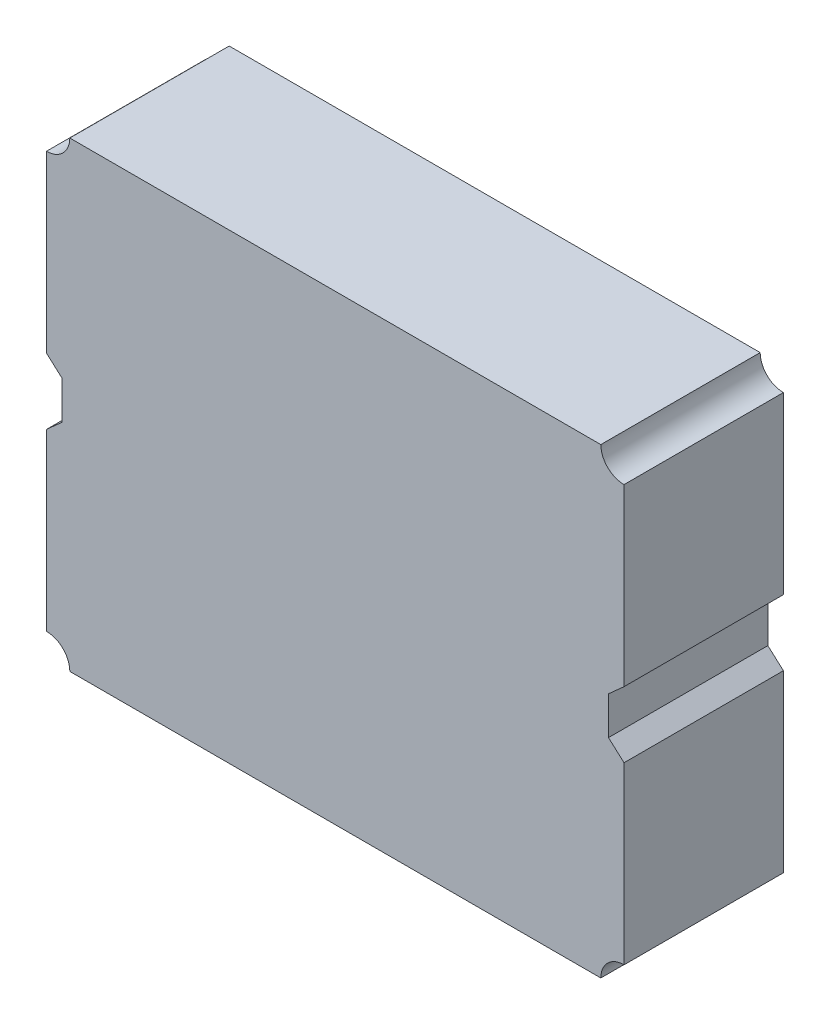
ISO-10303-21;
HEADER;
FILE_DESCRIPTION(('STEP AP214'),'2;1');
FILE_NAME('part.step','',(''),(''),'','','');
FILE_SCHEMA(('AUTOMOTIVE_DESIGN { 1 0 10303 214 1 1 1 1 }'));
ENDSEC;
DATA;
#1=APPLICATION_CONTEXT('core data for automotive mechanical design processes');
#2=APPLICATION_PROTOCOL_DEFINITION('international standard','automotive_design',2000,#1);
#3=PRODUCT_CONTEXT('',#1,'mechanical');
#4=PRODUCT('Part','Part','',(#3));
#5=PRODUCT_RELATED_PRODUCT_CATEGORY('part','',(#4));
#6=PRODUCT_DEFINITION_FORMATION('','',#4);
#7=PRODUCT_DEFINITION_CONTEXT('part definition',#1,'design');
#8=PRODUCT_DEFINITION('design','',#6,#7);
#9=PRODUCT_DEFINITION_SHAPE('','',#8);
#10=(LENGTH_UNIT() NAMED_UNIT(*) SI_UNIT(.MILLI.,.METRE.));
#11=(NAMED_UNIT(*) PLANE_ANGLE_UNIT() SI_UNIT($,.RADIAN.));
#12=(NAMED_UNIT(*) SI_UNIT($,.STERADIAN.) SOLID_ANGLE_UNIT());
#13=UNCERTAINTY_MEASURE_WITH_UNIT(LENGTH_MEASURE(1.E-05),#10,'distance_accuracy_value','');
#14=(GEOMETRIC_REPRESENTATION_CONTEXT(3) GLOBAL_UNCERTAINTY_ASSIGNED_CONTEXT((#13)) GLOBAL_UNIT_ASSIGNED_CONTEXT((#10,
#11,#12)) REPRESENTATION_CONTEXT('',''));
#15=CARTESIAN_POINT('',(0.,0.,0.));
#16=DIRECTION('',(0.,0.,1.));
#17=DIRECTION('',(1.,0.,0.));
#18=AXIS2_PLACEMENT_3D('',#15,#16,#17);
#19=CARTESIAN_POINT('',(0.,0.,0.));
#20=DIRECTION('',(0.,0.,1.));
#21=DIRECTION('',(1.,0.,0.));
#22=AXIS2_PLACEMENT_3D('',#19,#20,#21);
#23=PLANE('',#22);
#24=DIRECTION('',(0.744134494336564,0.668029830425608,0.));
#25=VECTOR('',#24,1.);
#26=CARTESIAN_POINT('',(1.216341717238,0.112366401347,0.));
#27=LINE('',#26,#25);
#28=CARTESIAN_POINT('',(1.18268343447503,0.0821504429447447,0.));
#29=VERTEX_POINT('',#28);
#30=CARTESIAN_POINT('',(1.2500000000001,0.142582359748888,0.));
#31=VERTEX_POINT('',#30);
#32=EDGE_CURVE('E191',#29,#31,#27,.T.);
#33=ORIENTED_EDGE('',*,*,#32,.F.);
#34=DIRECTION('',(0.,1.,0.));
#35=VECTOR('',#34,1.);
#36=CARTESIAN_POINT('',(1.182683434475,0.,0.));
#37=LINE('',#36,#35);
#38=CARTESIAN_POINT('',(1.18268343447503,-0.0821504429448401,0.));
#39=VERTEX_POINT('',#38);
#40=EDGE_CURVE('E202',#39,#29,#37,.T.);
#41=ORIENTED_EDGE('',*,*,#40,.F.);
#42=DIRECTION('',(-0.744134494336564,0.668029830425608,0.));
#43=VECTOR('',#42,1.);
#44=CARTESIAN_POINT('',(1.216341717238,-0.112366401347,0.));
#45=LINE('',#44,#43);
#46=CARTESIAN_POINT('',(1.2500000000002,-0.142582359748776,0.));
#47=VERTEX_POINT('',#46);
#48=EDGE_CURVE('E101',#47,#39,#45,.T.);
#49=ORIENTED_EDGE('',*,*,#48,.F.);
#50=DIRECTION('',(0.,1.,0.));
#51=VECTOR('',#50,1.);
#52=CARTESIAN_POINT('',(1.25,-0.521456601351,0.));
#53=LINE('',#52,#51);
#54=CARTESIAN_POINT('',(1.25,-0.900330842954046,0.));
#55=VERTEX_POINT('',#54);
#56=EDGE_CURVE('E95',#55,#47,#53,.T.);
#57=ORIENTED_EDGE('',*,*,#56,.F.);
#58=CARTESIAN_POINT('',(1.249135181183,-1.,0.));
#59=DIRECTION('',(0.,0.,-1.));
#60=DIRECTION('',(-1.,0.,0.));
#61=AXIS2_PLACEMENT_3D('',#58,#59,#60);
#62=CIRCLE('',#61,0.0996729089464);
#63=CARTESIAN_POINT('',(1.1494622722366,-1.,0.));
#64=VERTEX_POINT('',#63);
#65=EDGE_CURVE('E20',#64,#55,#62,.T.);
#66=ORIENTED_EDGE('',*,*,#65,.F.);
#67=DIRECTION('',(1.,0.,0.));
#68=VECTOR('',#67,1.);
#69=CARTESIAN_POINT('',(0.,-1.,0.));
#70=LINE('',#69,#68);
#71=CARTESIAN_POINT('',(-1.1494622722368,-1.,0.));
#72=VERTEX_POINT('',#71);
#73=EDGE_CURVE('E113',#72,#64,#70,.T.);
#74=ORIENTED_EDGE('',*,*,#73,.F.);
#75=CARTESIAN_POINT('',(-1.249135181183,-1.,0.));
#76=DIRECTION('',(0.,0.,-1.));
#77=DIRECTION('',(-1.,0.,0.));
#78=AXIS2_PLACEMENT_3D('',#75,#76,#77);
#79=CIRCLE('',#78,0.0996729089464);
#80=CARTESIAN_POINT('',(-1.25,-0.900330842954046,0.));
#81=VERTEX_POINT('',#80);
#82=EDGE_CURVE('E119',#72,#81,#79,.F.);
#83=ORIENTED_EDGE('',*,*,#82,.T.);
#84=DIRECTION('',(0.,1.,0.));
#85=VECTOR('',#84,1.);
#86=CARTESIAN_POINT('',(-1.25,-0.521456601351,0.));
#87=LINE('',#86,#85);
#88=CARTESIAN_POINT('',(-1.2500000000001,-0.142582359748888,0.));
#89=VERTEX_POINT('',#88);
#90=EDGE_CURVE('E123',#89,#81,#87,.F.);
#91=ORIENTED_EDGE('',*,*,#90,.F.);
#92=DIRECTION('',(-0.744134494336564,-0.668029830425608,0.));
#93=VECTOR('',#92,1.);
#94=CARTESIAN_POINT('',(-1.216341717238,-0.112366401347,0.));
#95=LINE('',#94,#93);
#96=CARTESIAN_POINT('',(-1.18268343447503,-0.0821504429447447,0.));
#97=VERTEX_POINT('',#96);
#98=EDGE_CURVE('E136',#97,#89,#95,.T.);
#99=ORIENTED_EDGE('',*,*,#98,.F.);
#100=DIRECTION('',(0.,1.,0.));
#101=VECTOR('',#100,1.);
#102=CARTESIAN_POINT('',(-1.182683434475,0.,0.));
#103=LINE('',#102,#101);
#104=CARTESIAN_POINT('',(-1.18268343447503,0.0821504429448809,0.));
#105=VERTEX_POINT('',#104);
#106=EDGE_CURVE('E147',#105,#97,#103,.F.);
#107=ORIENTED_EDGE('',*,*,#106,.F.);
#108=DIRECTION('',(0.744134494336564,-0.668029830425608,0.));
#109=VECTOR('',#108,1.);
#110=CARTESIAN_POINT('',(-1.216341717238,0.112366401347,0.));
#111=LINE('',#110,#109);
#112=CARTESIAN_POINT('',(-1.2500000000002,0.142582359748664,0.));
#113=VERTEX_POINT('',#112);
#114=EDGE_CURVE('E158',#113,#105,#111,.T.);
#115=ORIENTED_EDGE('',*,*,#114,.F.);
#116=DIRECTION('',(0.,1.,0.));
#117=VECTOR('',#116,1.);
#118=CARTESIAN_POINT('',(-1.25,0.521456601351,0.));
#119=LINE('',#118,#117);
#120=CARTESIAN_POINT('',(-1.25,0.900330842954023,0.));
#121=VERTEX_POINT('',#120);
#122=EDGE_CURVE('E164',#121,#113,#119,.F.);
#123=ORIENTED_EDGE('',*,*,#122,.F.);
#124=CARTESIAN_POINT('',(-1.249135181183,1.,0.));
#125=DIRECTION('',(0.,0.,-1.));
#126=DIRECTION('',(-1.,0.,0.));
#127=AXIS2_PLACEMENT_3D('',#124,#125,#126);
#128=CIRCLE('',#127,0.0996729089464);
#129=CARTESIAN_POINT('',(-1.1494622722366,1.,0.));
#130=VERTEX_POINT('',#129);
#131=EDGE_CURVE('E167',#121,#130,#128,.F.);
#132=ORIENTED_EDGE('',*,*,#131,.T.);
#133=DIRECTION('',(1.,0.,0.));
#134=VECTOR('',#133,1.);
#135=CARTESIAN_POINT('',(0.574731136118,1.,0.));
#136=LINE('',#135,#134);
#137=CARTESIAN_POINT('',(1.1494622722368,1.,0.));
#138=VERTEX_POINT('',#137);
#139=EDGE_CURVE('E171',#138,#130,#136,.F.);
#140=ORIENTED_EDGE('',*,*,#139,.F.);
#141=CARTESIAN_POINT('',(1.249135181183,1.,0.));
#142=DIRECTION('',(0.,0.,-1.));
#143=DIRECTION('',(-1.,0.,0.));
#144=AXIS2_PLACEMENT_3D('',#141,#142,#143);
#145=CIRCLE('',#144,0.0996729089464);
#146=CARTESIAN_POINT('',(1.25,0.900330842954046,0.));
#147=VERTEX_POINT('',#146);
#148=EDGE_CURVE('E174',#138,#147,#145,.F.);
#149=ORIENTED_EDGE('',*,*,#148,.T.);
#150=DIRECTION('',(0.,1.,0.));
#151=VECTOR('',#150,1.);
#152=CARTESIAN_POINT('',(1.25,0.521456601351,0.));
#153=LINE('',#152,#151);
#154=EDGE_CURVE('E178',#31,#147,#153,.T.);
#155=ORIENTED_EDGE('',*,*,#154,.F.);
#156=EDGE_LOOP('',(#33,#41,#49,#57,#66,#74,#83,#91,#99,#107,#115,#123,#132,#140,#149,#155));
#157=FACE_BOUND('',#156,.T.);
#158=ADVANCED_FACE('F17',(#157),#23,.F.);
#159=CARTESIAN_POINT('',(1.25,-0.521456601351,0.));
#160=DIRECTION('',(1.,0.,0.));
#161=DIRECTION('',(0.,1.,0.));
#162=AXIS2_PLACEMENT_3D('',#159,#160,#161);
#163=PLANE('',#162);
#164=DIRECTION('',(0.,1.,0.));
#165=VECTOR('',#164,1.);
#166=CARTESIAN_POINT('',(1.25,1.,0.69));
#167=LINE('',#166,#165);
#168=CARTESIAN_POINT('',(1.25,-0.900330842954046,0.69));
#169=VERTEX_POINT('',#168);
#170=CARTESIAN_POINT('',(1.2500000000001,-0.142582359748888,0.69));
#171=VERTEX_POINT('',#170);
#172=EDGE_CURVE('E108',#169,#171,#167,.T.);
#173=ORIENTED_EDGE('',*,*,#172,.F.);
#174=DIRECTION('',(0.,0.,-1.));
#175=VECTOR('',#174,1.);
#176=CARTESIAN_POINT('',(1.25,-0.900330842954046,0.));
#177=LINE('',#176,#175);
#178=EDGE_CURVE('E94',#169,#55,#177,.T.);
#179=ORIENTED_EDGE('',*,*,#178,.T.);
#180=ORIENTED_EDGE('',*,*,#56,.T.);
#181=DIRECTION('',(0.,0.,1.));
#182=VECTOR('',#181,1.);
#183=CARTESIAN_POINT('',(1.2500000000003,-0.142582359748664,0.));
#184=LINE('',#183,#182);
#185=EDGE_CURVE('E209',#171,#47,#184,.F.);
#186=ORIENTED_EDGE('',*,*,#185,.F.);
#187=EDGE_LOOP('',(#173,#179,#180,#186));
#188=FACE_BOUND('',#187,.T.);
#189=ADVANCED_FACE('F106',(#188),#163,.T.);
#190=CARTESIAN_POINT('',(1.216341717238,-0.112366401347,0.));
#191=DIRECTION('',(0.668029830425608,0.744134494336564,0.));
#192=DIRECTION('',(-0.744134494336564,0.668029830425608,0.));
#193=AXIS2_PLACEMENT_3D('',#190,#191,#192);
#194=PLANE('',#193);
#195=DIRECTION('',(-0.744134494334124,0.668029830428326,0.));
#196=VECTOR('',#195,1.);
#197=CARTESIAN_POINT('',(1.25,-0.142582359749,0.69));
#198=LINE('',#197,#196);
#199=CARTESIAN_POINT('',(1.182683434475,-0.08215044294487,0.69));
#200=VERTEX_POINT('',#199);
#201=EDGE_CURVE('E196',#171,#200,#198,.T.);
#202=ORIENTED_EDGE('',*,*,#201,.F.);
#203=ORIENTED_EDGE('',*,*,#185,.T.);
#204=ORIENTED_EDGE('',*,*,#48,.T.);
#205=DIRECTION('',(0.,0.,-1.));
#206=VECTOR('',#205,1.);
#207=CARTESIAN_POINT('',(1.182683434475,-0.08215044294487,0.));
#208=LINE('',#207,#206);
#209=EDGE_CURVE('E199',#200,#39,#208,.T.);
#210=ORIENTED_EDGE('',*,*,#209,.F.);
#211=EDGE_LOOP('',(#202,#203,#204,#210));
#212=FACE_BOUND('',#211,.T.);
#213=ADVANCED_FACE('F477',(#212),#194,.T.);
#214=CARTESIAN_POINT('',(1.182683434475,0.,0.));
#215=DIRECTION('',(1.,0.,0.));
#216=DIRECTION('',(0.,0.,-1.));
#217=AXIS2_PLACEMENT_3D('',#214,#215,#216);
#218=PLANE('',#217);
#219=DIRECTION('',(0.,1.,0.));
#220=VECTOR('',#219,1.);
#221=CARTESIAN_POINT('',(1.182683434475,1.,0.69));
#222=LINE('',#221,#220);
#223=CARTESIAN_POINT('',(1.18268343447501,0.0821504429447749,0.69));
#224=VERTEX_POINT('',#223);
#225=EDGE_CURVE('E185',#200,#224,#222,.T.);
#226=ORIENTED_EDGE('',*,*,#225,.F.);
#227=ORIENTED_EDGE('',*,*,#209,.T.);
#228=ORIENTED_EDGE('',*,*,#40,.T.);
#229=DIRECTION('',(0.,0.,1.));
#230=VECTOR('',#229,1.);
#231=CARTESIAN_POINT('',(1.18268343447504,0.0821504429447447,0.));
#232=LINE('',#231,#230);
#233=EDGE_CURVE('E188',#224,#29,#232,.F.);
#234=ORIENTED_EDGE('',*,*,#233,.F.);
#235=EDGE_LOOP('',(#226,#227,#228,#234));
#236=FACE_BOUND('',#235,.T.);
#237=ADVANCED_FACE('F467',(#236),#218,.T.);
#238=CARTESIAN_POINT('',(1.216341717238,0.112366401347,0.));
#239=DIRECTION('',(0.668029830425608,-0.744134494336564,0.));
#240=DIRECTION('',(0.744134494336564,0.668029830425608,0.));
#241=AXIS2_PLACEMENT_3D('',#238,#239,#240);
#242=PLANE('',#241);
#243=DIRECTION('',(0.744134494333684,0.668029830428815,0.));
#244=VECTOR('',#243,1.);
#245=CARTESIAN_POINT('',(1.182683434475,0.08215044294479,0.69));
#246=LINE('',#245,#244);
#247=CARTESIAN_POINT('',(1.25,0.142582359749,0.69));
#248=VERTEX_POINT('',#247);
#249=EDGE_CURVE('E181',#224,#248,#246,.T.);
#250=ORIENTED_EDGE('',*,*,#249,.F.);
#251=ORIENTED_EDGE('',*,*,#233,.T.);
#252=ORIENTED_EDGE('',*,*,#32,.T.);
#253=DIRECTION('',(0.,0.,-1.));
#254=VECTOR('',#253,1.);
#255=CARTESIAN_POINT('',(1.25,0.142582359749,0.));
#256=LINE('',#255,#254);
#257=EDGE_CURVE('E175',#248,#31,#256,.T.);
#258=ORIENTED_EDGE('',*,*,#257,.F.);
#259=EDGE_LOOP('',(#250,#251,#252,#258));
#260=FACE_BOUND('',#259,.T.);
#261=ADVANCED_FACE('F458',(#260),#242,.T.);
#262=CARTESIAN_POINT('',(1.25,0.521456601351,0.));
#263=DIRECTION('',(1.,0.,0.));
#264=DIRECTION('',(0.,0.,-1.));
#265=AXIS2_PLACEMENT_3D('',#262,#263,#264);
#266=PLANE('',#265);
#267=DIRECTION('',(0.,1.,0.));
#268=VECTOR('',#267,1.);
#269=CARTESIAN_POINT('',(1.25,1.,0.69));
#270=LINE('',#269,#268);
#271=CARTESIAN_POINT('',(1.25,0.900330842954046,0.69));
#272=VERTEX_POINT('',#271);
#273=EDGE_CURVE('E184',#248,#272,#270,.T.);
#274=ORIENTED_EDGE('',*,*,#273,.F.);
#275=ORIENTED_EDGE('',*,*,#257,.T.);
#276=ORIENTED_EDGE('',*,*,#154,.T.);
#277=DIRECTION('',(0.,0.,-1.));
#278=VECTOR('',#277,1.);
#279=CARTESIAN_POINT('',(1.25,0.900330842954046,0.));
#280=LINE('',#279,#278);
#281=EDGE_CURVE('E172',#147,#272,#280,.F.);
#282=ORIENTED_EDGE('',*,*,#281,.T.);
#283=EDGE_LOOP('',(#274,#275,#276,#282));
#284=FACE_BOUND('',#283,.T.);
#285=ADVANCED_FACE('F270',(#284),#266,.T.);
#286=CARTESIAN_POINT('',(1.249135181183,1.,0.));
#287=DIRECTION('',(0.,0.,-1.));
#288=DIRECTION('',(-1.,0.,0.));
#289=AXIS2_PLACEMENT_3D('',#286,#287,#288);
#290=CYLINDRICAL_SURFACE('',#289,0.0996729089464);
#291=ORIENTED_EDGE('',*,*,#148,.F.);
#292=DIRECTION('',(0.,0.,1.));
#293=VECTOR('',#292,1.);
#294=CARTESIAN_POINT('',(1.149462272237,1.,0.));
#295=LINE('',#294,#293);
#296=CARTESIAN_POINT('',(1.1494622722368,1.,0.69));
#297=VERTEX_POINT('',#296);
#298=EDGE_CURVE('E168',#297,#138,#295,.F.);
#299=ORIENTED_EDGE('',*,*,#298,.F.);
#300=CARTESIAN_POINT('',(1.249135181183,1.,0.69));
#301=DIRECTION('',(0.,0.,-1.));
#302=DIRECTION('',(-1.,0.,0.));
#303=AXIS2_PLACEMENT_3D('',#300,#301,#302);
#304=CIRCLE('',#303,0.0996729089464);
#305=EDGE_CURVE('E260',#272,#297,#304,.T.);
#306=ORIENTED_EDGE('',*,*,#305,.F.);
#307=ORIENTED_EDGE('',*,*,#281,.F.);
#308=EDGE_LOOP('',(#291,#299,#306,#307));
#309=FACE_BOUND('',#308,.T.);
#310=ADVANCED_FACE('F273',(#309),#290,.F.);
#311=CARTESIAN_POINT('',(0.574731136118,1.,0.));
#312=DIRECTION('',(0.,1.,0.));
#313=DIRECTION('',(0.,0.,1.));
#314=AXIS2_PLACEMENT_3D('',#311,#312,#313);
#315=PLANE('',#314);
#316=DIRECTION('',(1.,0.,0.));
#317=VECTOR('',#316,1.);
#318=CARTESIAN_POINT('',(0.,1.,0.69));
#319=LINE('',#318,#317);
#320=CARTESIAN_POINT('',(-1.1494622722366,1.,0.69));
#321=VERTEX_POINT('',#320);
#322=EDGE_CURVE('E259',#297,#321,#319,.F.);
#323=ORIENTED_EDGE('',*,*,#322,.F.);
#324=ORIENTED_EDGE('',*,*,#298,.T.);
#325=ORIENTED_EDGE('',*,*,#139,.T.);
#326=DIRECTION('',(0.,0.,-1.));
#327=VECTOR('',#326,1.);
#328=CARTESIAN_POINT('',(-1.1494622722366,1.,0.));
#329=LINE('',#328,#327);
#330=EDGE_CURVE('E165',#130,#321,#329,.F.);
#331=ORIENTED_EDGE('',*,*,#330,.T.);
#332=EDGE_LOOP('',(#323,#324,#325,#331));
#333=FACE_BOUND('',#332,.T.);
#334=ADVANCED_FACE('F347',(#333),#315,.T.);
#335=CARTESIAN_POINT('',(-1.249135181183,1.,0.));
#336=DIRECTION('',(0.,0.,-1.));
#337=DIRECTION('',(-1.,0.,0.));
#338=AXIS2_PLACEMENT_3D('',#335,#336,#337);
#339=CYLINDRICAL_SURFACE('',#338,0.0996729089464);
#340=ORIENTED_EDGE('',*,*,#131,.F.);
#341=DIRECTION('',(0.,0.,1.));
#342=VECTOR('',#341,1.);
#343=CARTESIAN_POINT('',(-1.25,0.900330842954,0.));
#344=LINE('',#343,#342);
#345=CARTESIAN_POINT('',(-1.25,0.900330842954023,0.69));
#346=VERTEX_POINT('',#345);
#347=EDGE_CURVE('E161',#346,#121,#344,.F.);
#348=ORIENTED_EDGE('',*,*,#347,.F.);
#349=CARTESIAN_POINT('',(-1.249135181183,1.,0.69));
#350=DIRECTION('',(0.,0.,-1.));
#351=DIRECTION('',(-1.,0.,0.));
#352=AXIS2_PLACEMENT_3D('',#349,#350,#351);
#353=CIRCLE('',#352,0.0996729089464);
#354=EDGE_CURVE('E256',#321,#346,#353,.T.);
#355=ORIENTED_EDGE('',*,*,#354,.F.);
#356=ORIENTED_EDGE('',*,*,#330,.F.);
#357=EDGE_LOOP('',(#340,#348,#355,#356));
#358=FACE_BOUND('',#357,.T.);
#359=ADVANCED_FACE('F344',(#358),#339,.F.);
#360=CARTESIAN_POINT('',(-1.25,0.521456601351,0.));
#361=DIRECTION('',(-1.,0.,0.));
#362=DIRECTION('',(0.,0.,1.));
#363=AXIS2_PLACEMENT_3D('',#360,#361,#362);
#364=PLANE('',#363);
#365=DIRECTION('',(0.,1.,0.));
#366=VECTOR('',#365,1.);
#367=CARTESIAN_POINT('',(-1.25,1.,0.69));
#368=LINE('',#367,#366);
#369=CARTESIAN_POINT('',(-1.2500000000001,0.142582359748888,0.69));
#370=VERTEX_POINT('',#369);
#371=EDGE_CURVE('E152',#346,#370,#368,.F.);
#372=ORIENTED_EDGE('',*,*,#371,.F.);
#373=ORIENTED_EDGE('',*,*,#347,.T.);
#374=ORIENTED_EDGE('',*,*,#122,.T.);
#375=DIRECTION('',(0.,0.,1.));
#376=VECTOR('',#375,1.);
#377=CARTESIAN_POINT('',(-1.2500000000003,0.142582359748664,0.));
#378=LINE('',#377,#376);
#379=EDGE_CURVE('E155',#370,#113,#378,.F.);
#380=ORIENTED_EDGE('',*,*,#379,.F.);
#381=EDGE_LOOP('',(#372,#373,#374,#380));
#382=FACE_BOUND('',#381,.T.);
#383=ADVANCED_FACE('F340',(#382),#364,.T.);
#384=CARTESIAN_POINT('',(-1.216341717238,0.112366401347,0.));
#385=DIRECTION('',(-0.668029830425608,-0.744134494336564,0.));
#386=DIRECTION('',(0.744134494336564,-0.668029830425608,0.));
#387=AXIS2_PLACEMENT_3D('',#384,#385,#386);
#388=PLANE('',#387);
#389=DIRECTION('',(0.744134494334399,-0.66802983042802,0.));
#390=VECTOR('',#389,1.);
#391=CARTESIAN_POINT('',(-1.25,0.142582359749,0.69));
#392=LINE('',#391,#390);
#393=CARTESIAN_POINT('',(-1.182683434475,0.08215044294492,0.69));
#394=VERTEX_POINT('',#393);
#395=EDGE_CURVE('E141',#370,#394,#392,.T.);
#396=ORIENTED_EDGE('',*,*,#395,.F.);
#397=ORIENTED_EDGE('',*,*,#379,.T.);
#398=ORIENTED_EDGE('',*,*,#114,.T.);
#399=DIRECTION('',(0.,0.,1.));
#400=VECTOR('',#399,1.);
#401=CARTESIAN_POINT('',(-1.182683434475,0.08215044294492,0.));
#402=LINE('',#401,#400);
#403=EDGE_CURVE('E144',#394,#105,#402,.F.);
#404=ORIENTED_EDGE('',*,*,#403,.F.);
#405=EDGE_LOOP('',(#396,#397,#398,#404));
#406=FACE_BOUND('',#405,.T.);
#407=ADVANCED_FACE('F337',(#406),#388,.T.);
#408=CARTESIAN_POINT('',(-1.182683434475,0.,0.));
#409=DIRECTION('',(-1.,0.,0.));
#410=DIRECTION('',(0.,0.,1.));
#411=AXIS2_PLACEMENT_3D('',#408,#409,#410);
#412=PLANE('',#411);
#413=DIRECTION('',(0.,1.,0.));
#414=VECTOR('',#413,1.);
#415=CARTESIAN_POINT('',(-1.182683434475,1.,0.69));
#416=LINE('',#415,#414);
#417=CARTESIAN_POINT('',(-1.18268343447501,-0.0821504429447751,0.69));
#418=VERTEX_POINT('',#417);
#419=EDGE_CURVE('E130',#394,#418,#416,.F.);
#420=ORIENTED_EDGE('',*,*,#419,.F.);
#421=ORIENTED_EDGE('',*,*,#403,.T.);
#422=ORIENTED_EDGE('',*,*,#106,.T.);
#423=DIRECTION('',(0.,0.,1.));
#424=VECTOR('',#423,1.);
#425=CARTESIAN_POINT('',(-1.18268343447504,-0.0821504429447447,0.));
#426=LINE('',#425,#424);
#427=EDGE_CURVE('E133',#418,#97,#426,.F.);
#428=ORIENTED_EDGE('',*,*,#427,.F.);
#429=EDGE_LOOP('',(#420,#421,#422,#428));
#430=FACE_BOUND('',#429,.T.);
#431=ADVANCED_FACE('F335',(#430),#412,.T.);
#432=CARTESIAN_POINT('',(-1.216341717238,-0.112366401347,0.));
#433=DIRECTION('',(-0.668029830425608,0.744134494336564,0.));
#434=DIRECTION('',(-0.744134494336564,-0.668029830425608,0.));
#435=AXIS2_PLACEMENT_3D('',#432,#433,#434);
#436=PLANE('',#435);
#437=DIRECTION('',(-0.744134494333684,-0.668029830428815,0.));
#438=VECTOR('',#437,1.);
#439=CARTESIAN_POINT('',(-1.182683434475,-0.08215044294479,0.69));
#440=LINE('',#439,#438);
#441=CARTESIAN_POINT('',(-1.25,-0.142582359749,0.69));
#442=VERTEX_POINT('',#441);
#443=EDGE_CURVE('E126',#418,#442,#440,.T.);
#444=ORIENTED_EDGE('',*,*,#443,.F.);
#445=ORIENTED_EDGE('',*,*,#427,.T.);
#446=ORIENTED_EDGE('',*,*,#98,.T.);
#447=DIRECTION('',(0.,0.,1.));
#448=VECTOR('',#447,1.);
#449=CARTESIAN_POINT('',(-1.25,-0.142582359749,0.));
#450=LINE('',#449,#448);
#451=EDGE_CURVE('E120',#442,#89,#450,.F.);
#452=ORIENTED_EDGE('',*,*,#451,.F.);
#453=EDGE_LOOP('',(#444,#445,#446,#452));
#454=FACE_BOUND('',#453,.T.);
#455=ADVANCED_FACE('F324',(#454),#436,.T.);
#456=CARTESIAN_POINT('',(-1.25,-0.521456601351,0.));
#457=DIRECTION('',(-1.,0.,0.));
#458=DIRECTION('',(0.,0.,1.));
#459=AXIS2_PLACEMENT_3D('',#456,#457,#458);
#460=PLANE('',#459);
#461=DIRECTION('',(0.,1.,0.));
#462=VECTOR('',#461,1.);
#463=CARTESIAN_POINT('',(-1.25,1.,0.69));
#464=LINE('',#463,#462);
#465=CARTESIAN_POINT('',(-1.25,-0.900330842954046,0.69));
#466=VERTEX_POINT('',#465);
#467=EDGE_CURVE('E129',#442,#466,#464,.F.);
#468=ORIENTED_EDGE('',*,*,#467,.F.);
#469=ORIENTED_EDGE('',*,*,#451,.T.);
#470=ORIENTED_EDGE('',*,*,#90,.T.);
#471=DIRECTION('',(0.,0.,-1.));
#472=VECTOR('',#471,1.);
#473=CARTESIAN_POINT('',(-1.25,-0.900330842954046,0.));
#474=LINE('',#473,#472);
#475=EDGE_CURVE('E117',#81,#466,#474,.F.);
#476=ORIENTED_EDGE('',*,*,#475,.T.);
#477=EDGE_LOOP('',(#468,#469,#470,#476));
#478=FACE_BOUND('',#477,.T.);
#479=ADVANCED_FACE('F327',(#478),#460,.T.);
#480=CARTESIAN_POINT('',(-1.249135181183,-1.,0.));
#481=DIRECTION('',(0.,0.,-1.));
#482=DIRECTION('',(-1.,0.,0.));
#483=AXIS2_PLACEMENT_3D('',#480,#481,#482);
#484=CYLINDRICAL_SURFACE('',#483,0.0996729089464);
#485=ORIENTED_EDGE('',*,*,#82,.F.);
#486=DIRECTION('',(0.,0.,-1.));
#487=VECTOR('',#486,1.);
#488=CARTESIAN_POINT('',(-1.149462272237,-1.,0.));
#489=LINE('',#488,#487);
#490=CARTESIAN_POINT('',(-1.1494622722368,-1.,0.69));
#491=VERTEX_POINT('',#490);
#492=EDGE_CURVE('E109',#491,#72,#489,.T.);
#493=ORIENTED_EDGE('',*,*,#492,.F.);
#494=CARTESIAN_POINT('',(-1.249135181183,-1.,0.69));
#495=DIRECTION('',(0.,0.,-1.));
#496=DIRECTION('',(-1.,0.,0.));
#497=AXIS2_PLACEMENT_3D('',#494,#495,#496);
#498=CIRCLE('',#497,0.0996729089464);
#499=EDGE_CURVE('E253',#466,#491,#498,.T.);
#500=ORIENTED_EDGE('',*,*,#499,.F.);
#501=ORIENTED_EDGE('',*,*,#475,.F.);
#502=EDGE_LOOP('',(#485,#493,#500,#501));
#503=FACE_BOUND('',#502,.T.);
#504=ADVANCED_FACE('F356',(#503),#484,.F.);
#505=CARTESIAN_POINT('',(0.,-1.,0.));
#506=DIRECTION('',(0.,-1.,0.));
#507=DIRECTION('',(0.,0.,-1.));
#508=AXIS2_PLACEMENT_3D('',#505,#506,#507);
#509=PLANE('',#508);
#510=DIRECTION('',(1.,0.,0.));
#511=VECTOR('',#510,1.);
#512=CARTESIAN_POINT('',(0.,-1.,0.69));
#513=LINE('',#512,#511);
#514=CARTESIAN_POINT('',(1.1494622722366,-1.,0.69));
#515=VERTEX_POINT('',#514);
#516=EDGE_CURVE('E26',#491,#515,#513,.T.);
#517=ORIENTED_EDGE('',*,*,#516,.F.);
#518=ORIENTED_EDGE('',*,*,#492,.T.);
#519=ORIENTED_EDGE('',*,*,#73,.T.);
#520=DIRECTION('',(0.,0.,-1.));
#521=VECTOR('',#520,1.);
#522=CARTESIAN_POINT('',(1.1494622722366,-1.,0.));
#523=LINE('',#522,#521);
#524=EDGE_CURVE('E35',#64,#515,#523,.F.);
#525=ORIENTED_EDGE('',*,*,#524,.T.);
#526=EDGE_LOOP('',(#517,#518,#519,#525));
#527=FACE_BOUND('',#526,.T.);
#528=ADVANCED_FACE('F353',(#527),#509,.T.);
#529=CARTESIAN_POINT('',(1.249135181183,-1.,0.));
#530=DIRECTION('',(0.,0.,-1.));
#531=DIRECTION('',(-1.,0.,0.));
#532=AXIS2_PLACEMENT_3D('',#529,#530,#531);
#533=CYLINDRICAL_SURFACE('',#532,0.0996729089464);
#534=ORIENTED_EDGE('',*,*,#65,.T.);
#535=ORIENTED_EDGE('',*,*,#178,.F.);
#536=CARTESIAN_POINT('',(1.249135181183,-1.,0.69));
#537=DIRECTION('',(0.,0.,-1.));
#538=DIRECTION('',(-1.,0.,0.));
#539=AXIS2_PLACEMENT_3D('',#536,#537,#538);
#540=CIRCLE('',#539,0.0996729089464);
#541=EDGE_CURVE('E11',#515,#169,#540,.T.);
#542=ORIENTED_EDGE('',*,*,#541,.F.);
#543=ORIENTED_EDGE('',*,*,#524,.F.);
#544=EDGE_LOOP('',(#534,#535,#542,#543));
#545=FACE_BOUND('',#544,.T.);
#546=ADVANCED_FACE('F92',(#545),#533,.F.);
#547=CARTESIAN_POINT('',(0.,1.,0.69));
#548=DIRECTION('',(0.,0.,1.));
#549=DIRECTION('',(1.,0.,0.));
#550=AXIS2_PLACEMENT_3D('',#547,#548,#549);
#551=PLANE('',#550);
#552=ORIENTED_EDGE('',*,*,#516,.T.);
#553=ORIENTED_EDGE('',*,*,#541,.T.);
#554=ORIENTED_EDGE('',*,*,#172,.T.);
#555=ORIENTED_EDGE('',*,*,#201,.T.);
#556=ORIENTED_EDGE('',*,*,#225,.T.);
#557=ORIENTED_EDGE('',*,*,#249,.T.);
#558=ORIENTED_EDGE('',*,*,#273,.T.);
#559=ORIENTED_EDGE('',*,*,#305,.T.);
#560=ORIENTED_EDGE('',*,*,#322,.T.);
#561=ORIENTED_EDGE('',*,*,#354,.T.);
#562=ORIENTED_EDGE('',*,*,#371,.T.);
#563=ORIENTED_EDGE('',*,*,#395,.T.);
#564=ORIENTED_EDGE('',*,*,#419,.T.);
#565=ORIENTED_EDGE('',*,*,#443,.T.);
#566=ORIENTED_EDGE('',*,*,#467,.T.);
#567=ORIENTED_EDGE('',*,*,#499,.T.);
#568=EDGE_LOOP('',(#552,#553,#554,#555,#556,#557,#558,#559,#560,#561,#562,#563,#564,#565,#566,#567));
#569=FACE_BOUND('',#568,.T.);
#570=ADVANCED_FACE('F279',(#569),#551,.T.);
#571=CLOSED_SHELL('',(#158,#189,#213,#237,#261,#285,#310,#334,#359,#383,#407,#431,#455,#479,
#504,#528,#546,#570));
#572=MANIFOLD_SOLID_BREP('B1',#571);
#573=ADVANCED_BREP_SHAPE_REPRESENTATION('',(#18,#572),#14);
#574=SHAPE_DEFINITION_REPRESENTATION(#9,#573);
ENDSEC;
END-ISO-10303-21;
